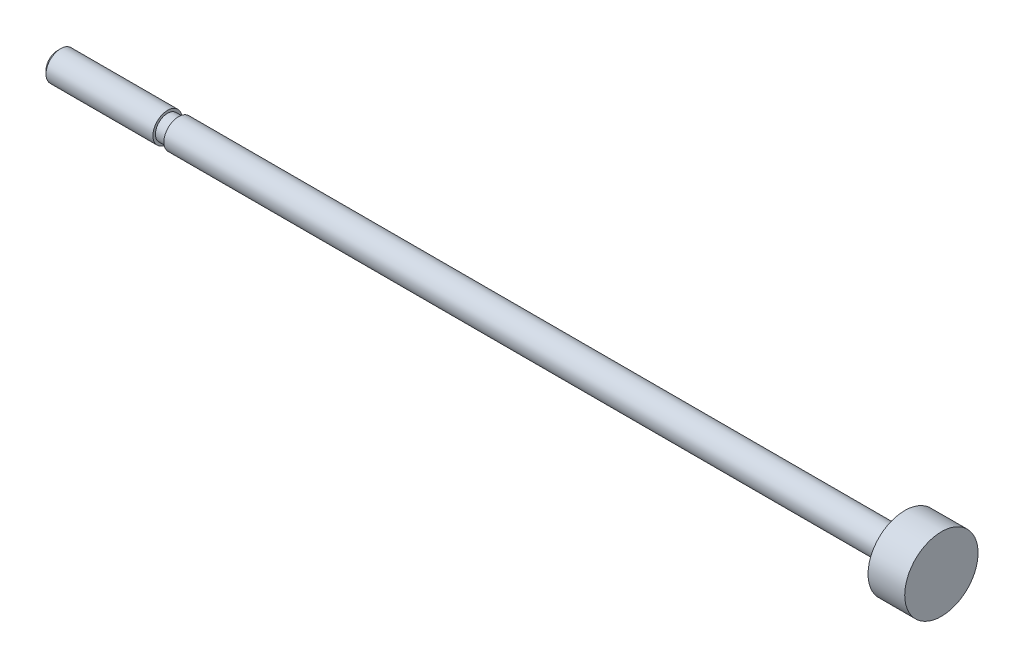
ISO-10303-21;
HEADER;
FILE_DESCRIPTION(('STEP AP214'),'2;1');
FILE_NAME('part.step','',(''),(''),'','','');
FILE_SCHEMA(('AUTOMOTIVE_DESIGN { 1 0 10303 214 1 1 1 1 }'));
ENDSEC;
DATA;
#1=APPLICATION_CONTEXT('core data for automotive mechanical design processes');
#2=APPLICATION_PROTOCOL_DEFINITION('international standard','automotive_design',2000,#1);
#3=PRODUCT_CONTEXT('',#1,'mechanical');
#4=PRODUCT('Part','Part','',(#3));
#5=PRODUCT_RELATED_PRODUCT_CATEGORY('part','',(#4));
#6=PRODUCT_DEFINITION_FORMATION('','',#4);
#7=PRODUCT_DEFINITION_CONTEXT('part definition',#1,'design');
#8=PRODUCT_DEFINITION('design','',#6,#7);
#9=PRODUCT_DEFINITION_SHAPE('','',#8);
#10=(LENGTH_UNIT() NAMED_UNIT(*) SI_UNIT(.MILLI.,.METRE.));
#11=(NAMED_UNIT(*) PLANE_ANGLE_UNIT() SI_UNIT($,.RADIAN.));
#12=(NAMED_UNIT(*) SI_UNIT($,.STERADIAN.) SOLID_ANGLE_UNIT());
#13=UNCERTAINTY_MEASURE_WITH_UNIT(LENGTH_MEASURE(1.E-05),#10,'distance_accuracy_value','');
#14=(GEOMETRIC_REPRESENTATION_CONTEXT(3) GLOBAL_UNCERTAINTY_ASSIGNED_CONTEXT((#13)) GLOBAL_UNIT_ASSIGNED_CONTEXT((#10,
#11,#12)) REPRESENTATION_CONTEXT('',''));
#15=CARTESIAN_POINT('',(0.,0.,0.));
#16=DIRECTION('',(0.,0.,1.));
#17=DIRECTION('',(1.,0.,0.));
#18=AXIS2_PLACEMENT_3D('',#15,#16,#17);
#19=CARTESIAN_POINT('',(0.,-1.57050000000001,1.57050012063279));
#20=DIRECTION('',(-1.,0.,0.));
#21=DIRECTION('',(0.,1.,0.));
#22=AXIS2_PLACEMENT_3D('',#19,#20,#21);
#23=PLANE('',#22);
#24=CARTESIAN_POINT('',(0.,0.,0.));
#25=DIRECTION('',(-1.,0.,0.));
#26=DIRECTION('',(0.,0.,-1.));
#27=AXIS2_PLACEMENT_3D('',#24,#25,#26);
#28=CIRCLE('',#27,1.5705);
#29=CARTESIAN_POINT('',(0.,0.,-1.5705));
#30=VERTEX_POINT('',#29);
#31=EDGE_CURVE('E47',#30,#30,#28,.F.);
#32=ORIENTED_EDGE('',*,*,#31,.F.);
#33=EDGE_LOOP('',(#32));
#34=FACE_BOUND('',#33,.T.);
#35=ADVANCED_FACE('F15',(#34),#23,.T.);
#36=CARTESIAN_POINT('',(15.,-2.,-2.));
#37=DIRECTION('',(1.,0.,0.));
#38=DIRECTION('',(0.,1.,0.));
#39=AXIS2_PLACEMENT_3D('',#36,#37,#38);
#40=PLANE('',#39);
#41=CARTESIAN_POINT('',(15.,0.,0.));
#42=DIRECTION('',(1.,0.,0.));
#43=DIRECTION('',(0.,0.,1.));
#44=AXIS2_PLACEMENT_3D('',#41,#42,#43);
#45=CIRCLE('',#44,2.);
#46=CARTESIAN_POINT('',(15.,0.,2.));
#47=VERTEX_POINT('',#46);
#48=EDGE_CURVE('E44',#47,#47,#45,.T.);
#49=ORIENTED_EDGE('',*,*,#48,.T.);
#50=EDGE_LOOP('',(#49));
#51=FACE_BOUND('',#50,.T.);
#52=CARTESIAN_POINT('',(15.,0.,0.));
#53=DIRECTION('',(-1.,0.,0.));
#54=DIRECTION('',(0.,0.,-1.));
#55=AXIS2_PLACEMENT_3D('',#52,#53,#54);
#56=CIRCLE('',#55,1.65);
#57=CARTESIAN_POINT('',(15.,0.,-1.65));
#58=VERTEX_POINT('',#57);
#59=EDGE_CURVE('E41',#58,#58,#56,.F.);
#60=ORIENTED_EDGE('',*,*,#59,.F.);
#61=EDGE_LOOP('',(#60));
#62=FACE_BOUND('',#61,.T.);
#63=ADVANCED_FACE('F54',(#51,#62),#40,.T.);
#64=CARTESIAN_POINT('',(16.5,-2.,2.));
#65=DIRECTION('',(-1.,0.,0.));
#66=DIRECTION('',(0.,1.,0.));
#67=AXIS2_PLACEMENT_3D('',#64,#65,#66);
#68=PLANE('',#67);
#69=CARTESIAN_POINT('',(16.5,0.,0.));
#70=DIRECTION('',(-1.,0.,0.));
#71=DIRECTION('',(0.,0.,-1.));
#72=AXIS2_PLACEMENT_3D('',#69,#70,#71);
#73=CIRCLE('',#72,2.);
#74=CARTESIAN_POINT('',(16.5,0.,-2.));
#75=VERTEX_POINT('',#74);
#76=EDGE_CURVE('E38',#75,#75,#73,.F.);
#77=ORIENTED_EDGE('',*,*,#76,.F.);
#78=EDGE_LOOP('',(#77));
#79=FACE_BOUND('',#78,.T.);
#80=CARTESIAN_POINT('',(16.5,0.,0.));
#81=DIRECTION('',(1.,0.,0.));
#82=DIRECTION('',(0.,0.,1.));
#83=AXIS2_PLACEMENT_3D('',#80,#81,#82);
#84=CIRCLE('',#83,1.65);
#85=CARTESIAN_POINT('',(16.5,0.,1.65));
#86=VERTEX_POINT('',#85);
#87=EDGE_CURVE('E35',#86,#86,#84,.T.);
#88=ORIENTED_EDGE('',*,*,#87,.T.);
#89=EDGE_LOOP('',(#88));
#90=FACE_BOUND('',#89,.T.);
#91=ADVANCED_FACE('F60',(#79,#90),#68,.T.);
#92=CARTESIAN_POINT('',(115.5,-5.,5.));
#93=DIRECTION('',(-1.,0.,0.));
#94=DIRECTION('',(0.,1.,0.));
#95=AXIS2_PLACEMENT_3D('',#92,#93,#94);
#96=PLANE('',#95);
#97=CARTESIAN_POINT('',(115.5,0.,0.));
#98=DIRECTION('',(-1.,0.,0.));
#99=DIRECTION('',(0.,0.,-1.));
#100=AXIS2_PLACEMENT_3D('',#97,#98,#99);
#101=CIRCLE('',#100,5.);
#102=CARTESIAN_POINT('',(115.5,0.,-5.));
#103=VERTEX_POINT('',#102);
#104=EDGE_CURVE('E30',#103,#103,#101,.F.);
#105=ORIENTED_EDGE('',*,*,#104,.F.);
#106=EDGE_LOOP('',(#105));
#107=FACE_BOUND('',#106,.T.);
#108=CARTESIAN_POINT('',(115.5,0.,0.));
#109=DIRECTION('',(1.,0.,0.));
#110=DIRECTION('',(0.,0.,1.));
#111=AXIS2_PLACEMENT_3D('',#108,#109,#110);
#112=CIRCLE('',#111,2.);
#113=CARTESIAN_POINT('',(115.5,0.,2.));
#114=VERTEX_POINT('',#113);
#115=EDGE_CURVE('E26',#114,#114,#112,.T.);
#116=ORIENTED_EDGE('',*,*,#115,.T.);
#117=EDGE_LOOP('',(#116));
#118=FACE_BOUND('',#117,.T.);
#119=ADVANCED_FACE('F66',(#107,#118),#96,.T.);
#120=CARTESIAN_POINT('',(120.5,-4.99999975829996,-5.00000000000001));
#121=DIRECTION('',(1.,0.,0.));
#122=DIRECTION('',(0.,1.,0.));
#123=AXIS2_PLACEMENT_3D('',#120,#121,#122);
#124=PLANE('',#123);
#125=CARTESIAN_POINT('',(120.5,0.,0.));
#126=DIRECTION('',(1.,0.,0.));
#127=DIRECTION('',(0.,-1.41721898572201E-07,0.99999999999999));
#128=AXIS2_PLACEMENT_3D('',#125,#126,#127);
#129=CIRCLE('',#128,5.);
#130=CARTESIAN_POINT('',(120.5,-7.08609492861005E-07,4.99999999999995));
#131=VERTEX_POINT('',#130);
#132=EDGE_CURVE('E22',#131,#131,#129,.T.);
#133=ORIENTED_EDGE('',*,*,#132,.T.);
#134=EDGE_LOOP('',(#133));
#135=FACE_BOUND('',#134,.T.);
#136=ADVANCED_FACE('F70',(#135),#124,.T.);
#137=CARTESIAN_POINT('',(0.429500000000001,0.,0.));
#138=DIRECTION('',(1.,0.,0.));
#139=DIRECTION('',(0.,1.42128072100685E-07,0.99999999999999));
#140=AXIS2_PLACEMENT_3D('',#137,#138,#139);
#141=CONICAL_SURFACE('',#140,2.,0.785398163397449);
#142=CARTESIAN_POINT('',(0.429499999999999,0.,0.));
#143=DIRECTION('',(-1.,0.,0.));
#144=DIRECTION('',(0.,0.,-1.));
#145=AXIS2_PLACEMENT_3D('',#142,#143,#144);
#146=CIRCLE('',#145,2.);
#147=CARTESIAN_POINT('',(0.429499999999999,0.,-2.));
#148=VERTEX_POINT('',#147);
#149=EDGE_CURVE('E10',#148,#148,#146,.F.);
#150=ORIENTED_EDGE('',*,*,#149,.F.);
#151=EDGE_LOOP('',(#150));
#152=FACE_BOUND('',#151,.T.);
#153=ORIENTED_EDGE('',*,*,#31,.T.);
#154=EDGE_LOOP('',(#153));
#155=FACE_BOUND('',#154,.T.);
#156=ADVANCED_FACE('F51',(#152,#155),#141,.T.);
#157=CARTESIAN_POINT('',(120.5,0.,0.));
#158=DIRECTION('',(1.,0.,0.));
#159=DIRECTION('',(0.,7.69313624256337E-10,1.));
#160=AXIS2_PLACEMENT_3D('',#157,#158,#159);
#161=CYLINDRICAL_SURFACE('',#160,2.);
#162=ORIENTED_EDGE('',*,*,#48,.F.);
#163=EDGE_LOOP('',(#162));
#164=FACE_BOUND('',#163,.T.);
#165=ORIENTED_EDGE('',*,*,#149,.T.);
#166=EDGE_LOOP('',(#165));
#167=FACE_BOUND('',#166,.T.);
#168=ADVANCED_FACE('F76',(#164,#167),#161,.T.);
#169=CARTESIAN_POINT('',(120.5,0.,0.));
#170=DIRECTION('',(1.,0.,0.));
#171=DIRECTION('',(0.,0.,1.));
#172=AXIS2_PLACEMENT_3D('',#169,#170,#171);
#173=CYLINDRICAL_SURFACE('',#172,1.65);
#174=ORIENTED_EDGE('',*,*,#87,.F.);
#175=EDGE_LOOP('',(#174));
#176=FACE_BOUND('',#175,.T.);
#177=ORIENTED_EDGE('',*,*,#59,.T.);
#178=EDGE_LOOP('',(#177));
#179=FACE_BOUND('',#178,.T.);
#180=ADVANCED_FACE('F80',(#176,#179),#173,.T.);
#181=CARTESIAN_POINT('',(120.5,0.,0.));
#182=DIRECTION('',(1.,0.,0.));
#183=DIRECTION('',(0.,0.,1.));
#184=AXIS2_PLACEMENT_3D('',#181,#182,#183);
#185=CYLINDRICAL_SURFACE('',#184,2.);
#186=ORIENTED_EDGE('',*,*,#115,.F.);
#187=EDGE_LOOP('',(#186));
#188=FACE_BOUND('',#187,.T.);
#189=ORIENTED_EDGE('',*,*,#76,.T.);
#190=EDGE_LOOP('',(#189));
#191=FACE_BOUND('',#190,.T.);
#192=ADVANCED_FACE('F83',(#188,#191),#185,.T.);
#193=CARTESIAN_POINT('',(120.5,0.,0.));
#194=DIRECTION('',(1.,0.,0.));
#195=DIRECTION('',(0.,0.,1.));
#196=AXIS2_PLACEMENT_3D('',#193,#194,#195);
#197=CYLINDRICAL_SURFACE('',#196,5.);
#198=ORIENTED_EDGE('',*,*,#132,.F.);
#199=EDGE_LOOP('',(#198));
#200=FACE_BOUND('',#199,.T.);
#201=ORIENTED_EDGE('',*,*,#104,.T.);
#202=EDGE_LOOP('',(#201));
#203=FACE_BOUND('',#202,.T.);
#204=ADVANCED_FACE('F17',(#200,#203),#197,.T.);
#205=CLOSED_SHELL('',(#35,#63,#91,#119,#136,#156,#168,#180,#192,#204));
#206=MANIFOLD_SOLID_BREP('B1',#205);
#207=ADVANCED_BREP_SHAPE_REPRESENTATION('',(#18,#206),#14);
#208=SHAPE_DEFINITION_REPRESENTATION(#9,#207);
ENDSEC;
END-ISO-10303-21;
